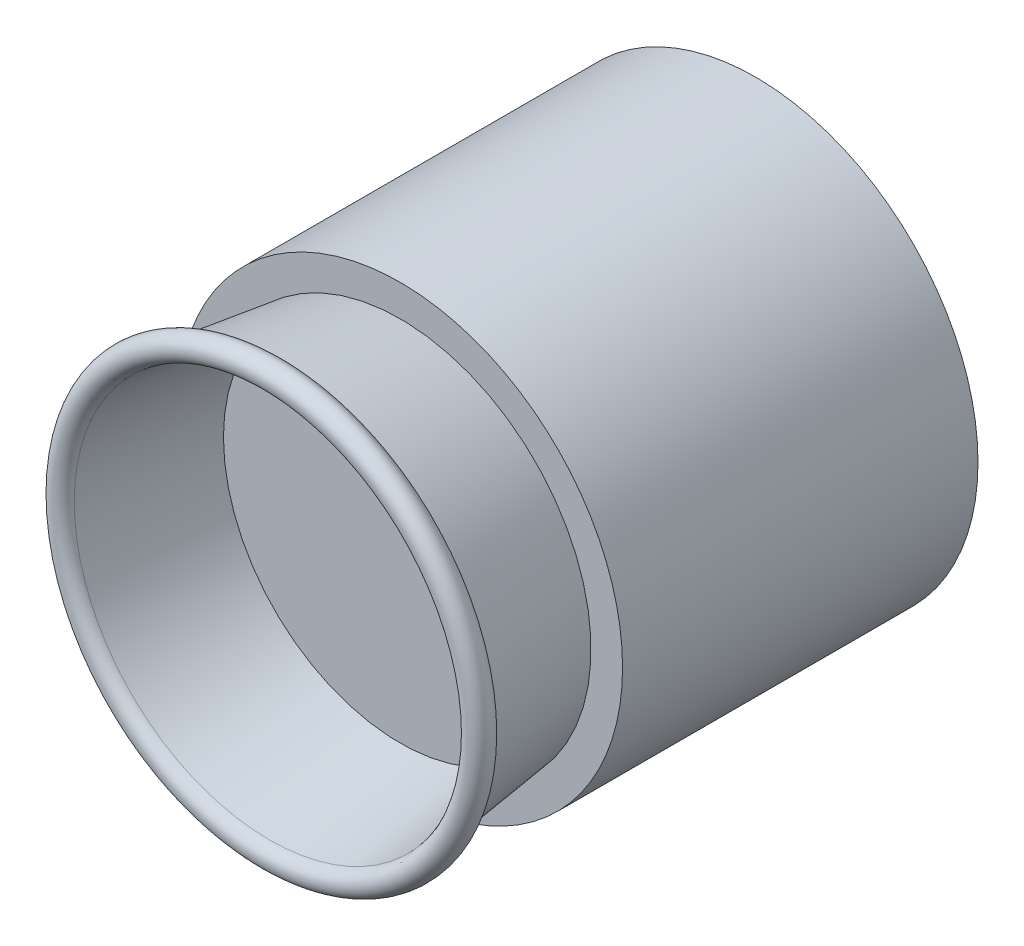
ISO-10303-21;
HEADER;
FILE_DESCRIPTION(('STEP AP214'),'2;1');
FILE_NAME('part.step','',(''),(''),'','','');
FILE_SCHEMA(('AUTOMOTIVE_DESIGN { 1 0 10303 214 1 1 1 1 }'));
ENDSEC;
DATA;
#1=APPLICATION_CONTEXT('core data for automotive mechanical design processes');
#2=APPLICATION_PROTOCOL_DEFINITION('international standard','automotive_design',2000,#1);
#3=PRODUCT_CONTEXT('',#1,'mechanical');
#4=PRODUCT('Part','Part','',(#3));
#5=PRODUCT_RELATED_PRODUCT_CATEGORY('part','',(#4));
#6=PRODUCT_DEFINITION_FORMATION('','',#4);
#7=PRODUCT_DEFINITION_CONTEXT('part definition',#1,'design');
#8=PRODUCT_DEFINITION('design','',#6,#7);
#9=PRODUCT_DEFINITION_SHAPE('','',#8);
#10=(LENGTH_UNIT() NAMED_UNIT(*) SI_UNIT(.MILLI.,.METRE.));
#11=(NAMED_UNIT(*) PLANE_ANGLE_UNIT() SI_UNIT($,.RADIAN.));
#12=(NAMED_UNIT(*) SI_UNIT($,.STERADIAN.) SOLID_ANGLE_UNIT());
#13=UNCERTAINTY_MEASURE_WITH_UNIT(LENGTH_MEASURE(1.E-05),#10,'distance_accuracy_value','');
#14=(GEOMETRIC_REPRESENTATION_CONTEXT(3) GLOBAL_UNCERTAINTY_ASSIGNED_CONTEXT((#13)) GLOBAL_UNIT_ASSIGNED_CONTEXT((#10,
#11,#12)) REPRESENTATION_CONTEXT('',''));
#15=CARTESIAN_POINT('',(0.,0.,0.));
#16=DIRECTION('',(0.,0.,1.));
#17=DIRECTION('',(1.,0.,0.));
#18=AXIS2_PLACEMENT_3D('',#15,#16,#17);
#19=CARTESIAN_POINT('',(0.,0.,67.5));
#20=DIRECTION('',(0.,0.,-1.));
#21=DIRECTION('',(-1.,0.,0.));
#22=AXIS2_PLACEMENT_3D('',#19,#20,#21);
#23=CYLINDRICAL_SURFACE('',#22,40.045098014483);
#24=CARTESIAN_POINT('',(0.,0.,67.5));
#25=DIRECTION('',(0.,0.,1.));
#26=DIRECTION('',(1.,0.,0.));
#27=AXIS2_PLACEMENT_3D('',#24,#25,#26);
#28=CIRCLE('',#27,40.045098014483);
#29=CARTESIAN_POINT('',(40.045098014483,0.,67.5));
#30=VERTEX_POINT('',#29);
#31=EDGE_CURVE('P0_E10',#30,#30,#28,.T.);
#32=ORIENTED_EDGE('',*,*,#31,.F.);
#33=EDGE_LOOP('',(#32));
#34=FACE_BOUND('',#33,.T.);
#35=CARTESIAN_POINT('',(0.,0.,3.5));
#36=DIRECTION('',(0.,0.,1.));
#37=DIRECTION('',(1.,0.,0.));
#38=AXIS2_PLACEMENT_3D('',#35,#36,#37);
#39=CIRCLE('',#38,40.045098014483);
#40=CARTESIAN_POINT('',(40.045098014483,0.,3.5));
#41=VERTEX_POINT('',#40);
#42=EDGE_CURVE('P0_E46',#41,#41,#39,.T.);
#43=ORIENTED_EDGE('',*,*,#42,.T.);
#44=EDGE_LOOP('',(#43));
#45=FACE_BOUND('',#44,.T.);
#46=ADVANCED_FACE('P0_F43',(#34,#45),#23,.T.);
#47=CARTESIAN_POINT('',(0.,0.,67.5));
#48=DIRECTION('',(0.,0.,1.));
#49=DIRECTION('',(1.,0.,0.));
#50=AXIS2_PLACEMENT_3D('',#47,#48,#49);
#51=PLANE('',#50);
#52=ORIENTED_EDGE('',*,*,#31,.T.);
#53=EDGE_LOOP('',(#52));
#54=FACE_BOUND('',#53,.T.);
#55=ADVANCED_FACE('P0_F58',(#54),#51,.T.);
#56=CARTESIAN_POINT('',(0.,0.,3.5));
#57=DIRECTION('',(0.,0.,1.));
#58=DIRECTION('',(1.,0.,0.));
#59=AXIS2_PLACEMENT_3D('',#56,#57,#58);
#60=PLANE('',#59);
#61=ORIENTED_EDGE('',*,*,#42,.F.);
#62=EDGE_LOOP('',(#61));
#63=FACE_BOUND('',#62,.T.);
#64=ADVANCED_FACE('P0_F56',(#63),#60,.F.);
#65=CLOSED_SHELL('',(#46,#55,#64));
#66=MANIFOLD_SOLID_BREP('P0_B2',#65);
#67=CARTESIAN_POINT('',(0.,0.,10.));
#68=DIRECTION('',(0.,0.,-1.));
#69=DIRECTION('',(-1.,0.,0.));
#70=AXIS2_PLACEMENT_3D('',#67,#68,#69);
#71=TOROIDAL_SURFACE('',#70,17.0649907413799,6.5);
#72=CARTESIAN_POINT('',(0.,0.,9.0831271399625));
#73=DIRECTION('',(0.,0.,-1.));
#74=DIRECTION('',(-1.,0.,0.));
#75=AXIS2_PLACEMENT_3D('',#72,#73,#74);
#76=CIRCLE('',#75,23.5);
#77=CARTESIAN_POINT('',(-23.5,0.,9.0831271399625));
#78=VERTEX_POINT('',#77);
#79=CARTESIAN_POINT('',(23.5,0.,9.0831271399625));
#80=VERTEX_POINT('',#79);
#81=EDGE_CURVE('P1_E80',#78,#80,#76,.T.);
#82=ORIENTED_EDGE('',*,*,#81,.F.);
#83=CARTESIAN_POINT('',(0.,0.,9.0831271399625));
#84=DIRECTION('',(0.,0.,-1.));
#85=DIRECTION('',(-1.,0.,0.));
#86=AXIS2_PLACEMENT_3D('',#83,#84,#85);
#87=CIRCLE('',#86,23.5);
#88=EDGE_CURVE('P1_E73',#80,#78,#87,.T.);
#89=ORIENTED_EDGE('',*,*,#88,.F.);
#90=CARTESIAN_POINT('',(17.0649907413799,0.,10.));
#91=DIRECTION('',(0.,1.,0.));
#92=DIRECTION('',(1.,0.,0.));
#93=AXIS2_PLACEMENT_3D('',#90,#91,#92);
#94=CIRCLE('',#93,6.5);
#95=CARTESIAN_POINT('',(17.0649907413799,0.,3.5));
#96=VERTEX_POINT('',#95);
#97=EDGE_CURVE('P1_E11',#80,#96,#94,.T.);
#98=ORIENTED_EDGE('',*,*,#97,.T.);
#99=CARTESIAN_POINT('',(0.,0.,3.5));
#100=DIRECTION('',(0.,0.,-1.));
#101=DIRECTION('',(-1.,0.,0.));
#102=AXIS2_PLACEMENT_3D('',#99,#100,#101);
#103=CIRCLE('',#102,17.0649907413799);
#104=EDGE_CURVE('P1_E119',#96,#96,#103,.T.);
#105=ORIENTED_EDGE('',*,*,#104,.T.);
#106=ORIENTED_EDGE('',*,*,#97,.F.);
#107=EDGE_LOOP('',(#82,#89,#98,#105,#106));
#108=FACE_BOUND('',#107,.T.);
#109=ADVANCED_FACE('P1_F16',(#108),#71,.F.);
#110=CARTESIAN_POINT('',(0.,0.,91.0057450093186));
#111=DIRECTION('',(0.,0.,1.));
#112=DIRECTION('',(1.,0.,0.));
#113=AXIS2_PLACEMENT_3D('',#110,#111,#112);
#114=CONICAL_SURFACE('',#113,35.172496795093,0.141529375640819);
#115=ORIENTED_EDGE('',*,*,#81,.T.);
#116=ORIENTED_EDGE('',*,*,#88,.T.);
#117=DIRECTION('',(-0.141057363082695,0.,0.990001424403095));
#118=VECTOR('',#117,1.);
#119=CARTESIAN_POINT('',(-35.172496795093,0.,91.0057450093186));
#120=LINE('',#119,#118);
#121=CARTESIAN_POINT('',(-35.172496795093,0.,91.0057450093186));
#122=VERTEX_POINT('',#121);
#123=EDGE_CURVE('P1_E25',#78,#122,#120,.T.);
#124=ORIENTED_EDGE('',*,*,#123,.T.);
#125=CARTESIAN_POINT('',(0.,0.,91.0057450093186));
#126=DIRECTION('',(0.,0.,-1.));
#127=DIRECTION('',(-1.,0.,0.));
#128=AXIS2_PLACEMENT_3D('',#125,#126,#127);
#129=CIRCLE('',#128,35.172496795093);
#130=CARTESIAN_POINT('',(35.172496795093,0.,91.0057450093186));
#131=VERTEX_POINT('',#130);
#132=EDGE_CURVE('P1_E71',#131,#122,#129,.T.);
#133=ORIENTED_EDGE('',*,*,#132,.F.);
#134=CARTESIAN_POINT('',(0.,0.,91.0057450093186));
#135=DIRECTION('',(0.,0.,-1.));
#136=DIRECTION('',(-1.,0.,0.));
#137=AXIS2_PLACEMENT_3D('',#134,#135,#136);
#138=CIRCLE('',#137,35.172496795093);
#139=EDGE_CURVE('P1_E76',#122,#131,#138,.T.);
#140=ORIENTED_EDGE('',*,*,#139,.F.);
#141=ORIENTED_EDGE('',*,*,#123,.F.);
#142=EDGE_LOOP('',(#115,#116,#124,#133,#140,#141));
#143=FACE_BOUND('',#142,.T.);
#144=ADVANCED_FACE('P1_F69',(#143),#114,.F.);
#145=CARTESIAN_POINT('',(0.,0.,90.6883659423825));
#146=DIRECTION('',(0.,0.,-1.));
#147=DIRECTION('',(-1.,0.,0.));
#148=AXIS2_PLACEMENT_3D('',#145,#146,#147);
#149=TOROIDAL_SURFACE('',#148,37.4,2.25);
#150=CARTESIAN_POINT('',(0.,0.,88.4573485652722));
#151=DIRECTION('',(0.,0.,-1.));
#152=DIRECTION('',(-1.,0.,0.));
#153=AXIS2_PLACEMENT_3D('',#150,#151,#152);
#154=CIRCLE('',#153,37.108347016076);
#155=CARTESIAN_POINT('',(-37.108347016076,0.,88.4573485652722));
#156=VERTEX_POINT('',#155);
#157=CARTESIAN_POINT('',(37.108347016076,0.,88.4573485652722));
#158=VERTEX_POINT('',#157);
#159=EDGE_CURVE('P1_E104',#156,#158,#154,.T.);
#160=ORIENTED_EDGE('',*,*,#159,.F.);
#161=CARTESIAN_POINT('',(0.,0.,88.4573485652722));
#162=DIRECTION('',(0.,0.,-1.));
#163=DIRECTION('',(-1.,0.,0.));
#164=AXIS2_PLACEMENT_3D('',#161,#162,#163);
#165=CIRCLE('',#164,37.108347016076);
#166=EDGE_CURVE('P1_E106',#158,#156,#165,.T.);
#167=ORIENTED_EDGE('',*,*,#166,.F.);
#168=CARTESIAN_POINT('',(37.4,0.,90.6883659423825));
#169=DIRECTION('',(0.,-1.,0.));
#170=DIRECTION('',(1.,0.,0.));
#171=AXIS2_PLACEMENT_3D('',#168,#169,#170);
#172=CIRCLE('',#171,2.25);
#173=EDGE_CURVE('P1_E85',#158,#131,#172,.T.);
#174=ORIENTED_EDGE('',*,*,#173,.T.);
#175=ORIENTED_EDGE('',*,*,#132,.T.);
#176=ORIENTED_EDGE('',*,*,#139,.T.);
#177=ORIENTED_EDGE('',*,*,#173,.F.);
#178=EDGE_LOOP('',(#160,#167,#174,#175,#176,#177));
#179=FACE_BOUND('',#178,.T.);
#180=ADVANCED_FACE('P1_F83',(#179),#149,.T.);
#181=CARTESIAN_POINT('',(0.,0.,3.61938331949259));
#182=DIRECTION('',(0.,0.,-1.));
#183=DIRECTION('',(-1.,0.,0.));
#184=AXIS2_PLACEMENT_3D('',#181,#182,#183);
#185=TOROIDAL_SURFACE('',#184,21.9837468851372,4.);
#186=CARTESIAN_POINT('',(0.,0.,-0.369624362033333));
#187=DIRECTION('',(0.,0.,-1.));
#188=DIRECTION('',(-1.,0.,0.));
#189=AXIS2_PLACEMENT_3D('',#186,#187,#188);
#190=CIRCLE('',#189,21.6874063433159);
#191=CARTESIAN_POINT('',(21.6874063433159,0.,-0.369624362033321));
#192=VERTEX_POINT('',#191);
#193=EDGE_CURVE('P1_E123',#192,#192,#190,.T.);
#194=ORIENTED_EDGE('',*,*,#193,.F.);
#195=CARTESIAN_POINT('',(21.9837468851372,0.,3.61938331949259));
#196=DIRECTION('',(0.,-1.,0.));
#197=DIRECTION('',(1.,0.,0.));
#198=AXIS2_PLACEMENT_3D('',#195,#196,#197);
#199=CIRCLE('',#198,4.);
#200=CARTESIAN_POINT('',(25.95,0.,3.10088912584996));
#201=VERTEX_POINT('',#200);
#202=EDGE_CURVE('P1_E92',#192,#201,#199,.T.);
#203=ORIENTED_EDGE('',*,*,#202,.T.);
#204=CARTESIAN_POINT('',(0.,0.,3.10088912584996));
#205=DIRECTION('',(0.,0.,-1.));
#206=DIRECTION('',(-1.,0.,0.));
#207=AXIS2_PLACEMENT_3D('',#204,#205,#206);
#208=CIRCLE('',#207,25.95);
#209=CARTESIAN_POINT('',(-25.95,0.,3.10088912584996));
#210=VERTEX_POINT('',#209);
#211=EDGE_CURVE('P1_E113',#201,#210,#208,.T.);
#212=ORIENTED_EDGE('',*,*,#211,.T.);
#213=CARTESIAN_POINT('',(0.,0.,3.10088912584996));
#214=DIRECTION('',(0.,0.,-1.));
#215=DIRECTION('',(-1.,0.,0.));
#216=AXIS2_PLACEMENT_3D('',#213,#214,#215);
#217=CIRCLE('',#216,25.95);
#218=EDGE_CURVE('P1_E118',#210,#201,#217,.T.);
#219=ORIENTED_EDGE('',*,*,#218,.T.);
#220=ORIENTED_EDGE('',*,*,#202,.F.);
#221=EDGE_LOOP('',(#194,#203,#212,#219,#220));
#222=FACE_BOUND('',#221,.T.);
#223=ADVANCED_FACE('P1_F135',(#222),#185,.T.);
#224=CARTESIAN_POINT('',(0.,0.,0.));
#225=CARTESIAN_POINT('',(0.,0.,0.));
#226=CARTESIAN_POINT('',(0.,0.,0.));
#227=CARTESIAN_POINT('',(0.,0.,0.));
#228=CARTESIAN_POINT('',(0.,0.,0.));
#229=CARTESIAN_POINT('',(0.,0.,0.));
#230=CARTESIAN_POINT('',(0.,0.,0.));
#231=CARTESIAN_POINT('',(0.,0.,0.));
#232=CARTESIAN_POINT('',(0.,0.,0.));
#233=CARTESIAN_POINT('',(10.8542695543779,0.,0.435161660446449));
#234=CARTESIAN_POINT('',(10.8542695543779,-10.8542695543779,0.435161660446449));
#235=CARTESIAN_POINT('',(0.,-10.8542695543779,0.435161660446433));
#236=CARTESIAN_POINT('',(-10.8542695543779,-10.8542695543779,0.435161660446417));
#237=CARTESIAN_POINT('',(-10.8542695543779,0.,0.435161660446417));
#238=CARTESIAN_POINT('',(-10.8542695543779,10.8542695543779,0.435161660446417));
#239=CARTESIAN_POINT('',(0.,10.8542695543779,0.435161660446433));
#240=CARTESIAN_POINT('',(10.8542695543779,10.8542695543779,0.435161660446449));
#241=CARTESIAN_POINT('',(10.8542695543779,0.,0.435161660446449));
#242=CARTESIAN_POINT('',(21.6874063433159,0.,-0.369624362033321));
#243=CARTESIAN_POINT('',(21.6874063433159,-21.6874063433159,-0.369624362033321));
#244=CARTESIAN_POINT('',(0.,-21.6874063433159,-0.369624362033321));
#245=CARTESIAN_POINT('',(-21.6874063433159,-21.6874063433159,-0.369624362033321));
#246=CARTESIAN_POINT('',(-21.6874063433159,0.,-0.369624362033321));
#247=CARTESIAN_POINT('',(-21.6874063433159,21.6874063433159,-0.369624362033321));
#248=CARTESIAN_POINT('',(0.,21.6874063433159,-0.369624362033321));
#249=CARTESIAN_POINT('',(21.6874063433159,21.6874063433159,-0.369624362033321));
#250=CARTESIAN_POINT('',(21.6874063433159,0.,-0.369624362033321));
#251=(BOUNDED_SURFACE() B_SPLINE_SURFACE(2,2,((#224,#225,#226,#227,#228,#229,#230,#231,#232),
(#233,#234,#235,#236,#237,#238,#239,#240,#241),(#242,#243,#244,#245,#246,#247,#248,#249,#250)),
.UNSPECIFIED.,.F.,.T.,.F.) B_SPLINE_SURFACE_WITH_KNOTS((3,3),(3,2,2,2,3),(-1.61086615701945,
-1.49664325270317),(-3.14159265358979,-1.5707963267949,0.,1.5707963267949,3.14159265358979),
.UNSPECIFIED.) GEOMETRIC_REPRESENTATION_ITEM() RATIONAL_B_SPLINE_SURFACE(((1.,0.707106781186548,
1.,0.707106781186548,1.,0.707106781186548,1.,0.707106781186548,1.),(0.998369584251428,
0.705953903154579,0.998369584251428,0.705953903154579,0.998369584251428,0.705953903154579,
0.998369584251428,0.705953903154579,0.998369584251428),(1.,0.707106781186548,1.,
0.707106781186548,1.,0.707106781186548,1.,0.707106781186548,1.))) REPRESENTATION_ITEM('') SURFACE());
#252=CARTESIAN_POINT('',(7.61123060681179,0.,-189.847489234517));
#253=DIRECTION('',(0.,1.,0.));
#254=DIRECTION('',(1.,0.,0.));
#255=AXIS2_PLACEMENT_3D('',#252,#253,#254);
#256=CIRCLE('',#255,190.);
#257=CARTESIAN_POINT('',(0.,0.,0.));
#258=VERTEX_POINT('',#257);
#259=EDGE_CURVE('P1_E122',#258,#192,#256,.T.);
#260=ORIENTED_EDGE('',*,*,#259,.T.);
#261=ORIENTED_EDGE('',*,*,#193,.T.);
#262=ORIENTED_EDGE('',*,*,#259,.F.);
#263=EDGE_LOOP('',(#260,#261,#262));
#264=FACE_BOUND('',#263,.T.);
#265=ADVANCED_FACE('P1_F210',(#264),#251,.T.);
#266=CARTESIAN_POINT('',(0.,17.0649907413799,3.5));
#267=DIRECTION('',(0.,0.,1.));
#268=DIRECTION('',(1.,0.,0.));
#269=AXIS2_PLACEMENT_3D('',#266,#267,#268);
#270=PLANE('',#269);
#271=ORIENTED_EDGE('',*,*,#104,.F.);
#272=EDGE_LOOP('',(#271));
#273=FACE_BOUND('',#272,.T.);
#274=ADVANCED_FACE('P1_F199',(#273),#270,.T.);
#275=CARTESIAN_POINT('',(0.,0.,3.10088912584996));
#276=DIRECTION('',(0.,0.,1.));
#277=DIRECTION('',(1.,0.,0.));
#278=AXIS2_PLACEMENT_3D('',#275,#276,#277);
#279=CONICAL_SURFACE('',#278,25.95,0.129989315642614);
#280=ORIENTED_EDGE('',*,*,#159,.T.);
#281=ORIENTED_EDGE('',*,*,#166,.T.);
#282=DIRECTION('',(0.129623548410653,0.,-0.991563278715701));
#283=VECTOR('',#282,1.);
#284=CARTESIAN_POINT('',(-25.95,0.,3.10088912584996));
#285=LINE('',#284,#283);
#286=EDGE_CURVE('P1_E110',#156,#210,#285,.T.);
#287=ORIENTED_EDGE('',*,*,#286,.T.);
#288=ORIENTED_EDGE('',*,*,#211,.F.);
#289=ORIENTED_EDGE('',*,*,#218,.F.);
#290=ORIENTED_EDGE('',*,*,#286,.F.);
#291=EDGE_LOOP('',(#280,#281,#287,#288,#289,#290));
#292=FACE_BOUND('',#291,.T.);
#293=ADVANCED_FACE('P1_F142',(#292),#279,.T.);
#294=CLOSED_SHELL('',(#109,#144,#180,#223,#265,#274,#293));
#295=MANIFOLD_SOLID_BREP('P1_B1',#294);
#296=ADVANCED_BREP_SHAPE_REPRESENTATION('',(#18,#66,#295),#14);
#297=SHAPE_DEFINITION_REPRESENTATION(#9,#296);
ENDSEC;
END-ISO-10303-21;
